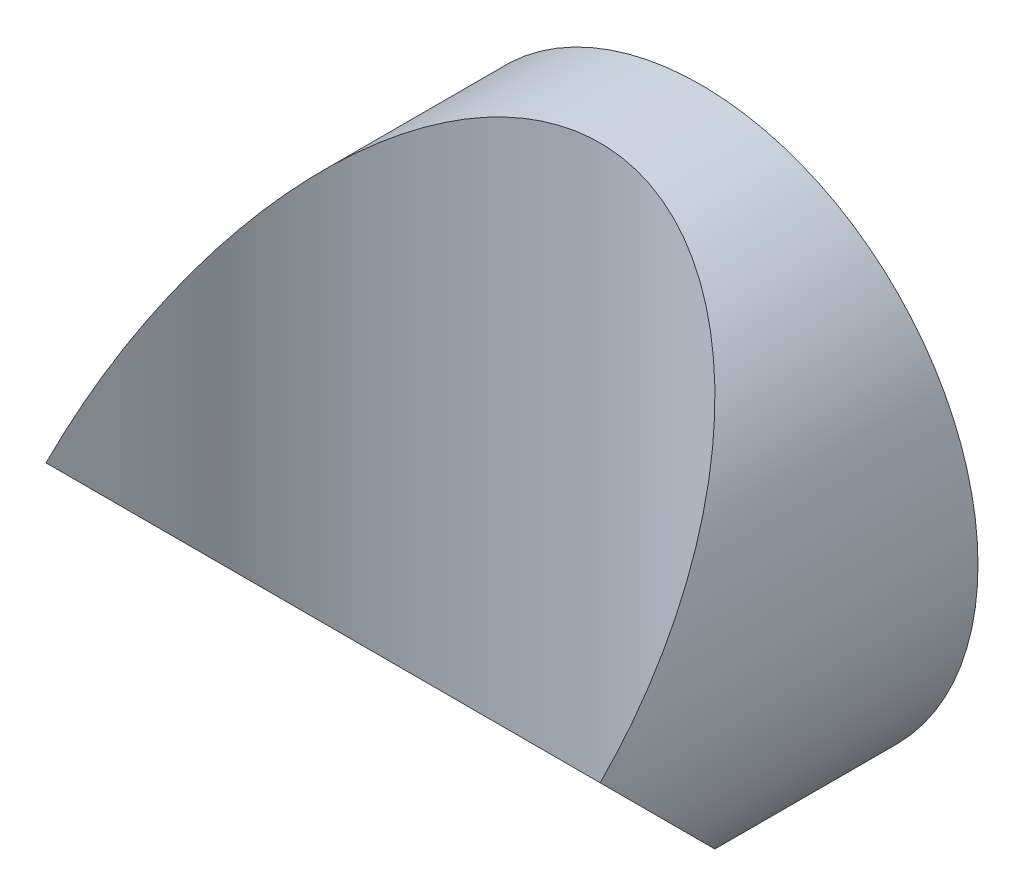
ISO-10303-21;
HEADER;
FILE_DESCRIPTION(('STEP AP214'),'2;1');
FILE_NAME('part.step','',(''),(''),'','','');
FILE_SCHEMA(('AUTOMOTIVE_DESIGN { 1 0 10303 214 1 1 1 1 }'));
ENDSEC;
DATA;
#1=APPLICATION_CONTEXT('core data for automotive mechanical design processes');
#2=APPLICATION_PROTOCOL_DEFINITION('international standard','automotive_design',2000,#1);
#3=PRODUCT_CONTEXT('',#1,'mechanical');
#4=PRODUCT('Part','Part','',(#3));
#5=PRODUCT_RELATED_PRODUCT_CATEGORY('part','',(#4));
#6=PRODUCT_DEFINITION_FORMATION('','',#4);
#7=PRODUCT_DEFINITION_CONTEXT('part definition',#1,'design');
#8=PRODUCT_DEFINITION('design','',#6,#7);
#9=PRODUCT_DEFINITION_SHAPE('','',#8);
#10=(LENGTH_UNIT() NAMED_UNIT(*) SI_UNIT(.MILLI.,.METRE.));
#11=(NAMED_UNIT(*) PLANE_ANGLE_UNIT() SI_UNIT($,.RADIAN.));
#12=(NAMED_UNIT(*) SI_UNIT($,.STERADIAN.) SOLID_ANGLE_UNIT());
#13=UNCERTAINTY_MEASURE_WITH_UNIT(LENGTH_MEASURE(1.E-05),#10,'distance_accuracy_value','');
#14=(GEOMETRIC_REPRESENTATION_CONTEXT(3) GLOBAL_UNCERTAINTY_ASSIGNED_CONTEXT((#13)) GLOBAL_UNIT_ASSIGNED_CONTEXT((#10,
#11,#12)) REPRESENTATION_CONTEXT('',''));
#15=CARTESIAN_POINT('',(0.,0.,0.));
#16=DIRECTION('',(0.,0.,1.));
#17=DIRECTION('',(1.,0.,0.));
#18=AXIS2_PLACEMENT_3D('',#15,#16,#17);
#19=CARTESIAN_POINT('',(0.,0.,27.27));
#20=DIRECTION('',(0.,0.,-1.));
#21=DIRECTION('',(-1.,0.,0.));
#22=AXIS2_PLACEMENT_3D('',#19,#20,#21);
#23=CYLINDRICAL_SURFACE('',#22,20.);
#24=CARTESIAN_POINT('',(0.,0.,0.));
#25=DIRECTION('',(0.,0.,1.));
#26=DIRECTION('',(1.,0.,0.));
#27=AXIS2_PLACEMENT_3D('',#24,#25,#26);
#28=CIRCLE('',#27,20.);
#29=CARTESIAN_POINT('',(20.,0.,0.));
#30=VERTEX_POINT('',#29);
#31=EDGE_CURVE('E11',#30,#30,#28,.T.);
#32=ORIENTED_EDGE('',*,*,#31,.T.);
#33=EDGE_LOOP('',(#32));
#34=FACE_BOUND('',#33,.T.);
#35=CARTESIAN_POINT('',(0.,0.,27.27));
#36=DIRECTION('',(0.,0.707106781186547,-0.707106781186547));
#37=DIRECTION('',(0.,-0.707106781186547,-0.707106781186547));
#38=AXIS2_PLACEMENT_3D('',#35,#36,#37);
#39=ELLIPSE('',#38,28.2842712474619,20.);
#40=CARTESIAN_POINT('',(-20.,0.,27.27));
#41=VERTEX_POINT('',#40);
#42=CARTESIAN_POINT('',(20.,0.,27.27));
#43=VERTEX_POINT('',#42);
#44=EDGE_CURVE('E54',#41,#43,#39,.F.);
#45=ORIENTED_EDGE('',*,*,#44,.F.);
#46=CARTESIAN_POINT('',(0.,0.,27.27));
#47=DIRECTION('',(0.,-0.707106781186547,-0.707106781186547));
#48=DIRECTION('',(0.,0.707106781186547,-0.707106781186547));
#49=AXIS2_PLACEMENT_3D('',#46,#47,#48);
#50=ELLIPSE('',#49,28.2842712474619,20.);
#51=EDGE_CURVE('E47',#43,#41,#50,.F.);
#52=ORIENTED_EDGE('',*,*,#51,.F.);
#53=EDGE_LOOP('',(#45,#52));
#54=FACE_BOUND('',#53,.T.);
#55=ADVANCED_FACE('F40',(#34,#54),#23,.T.);
#56=CARTESIAN_POINT('',(0.,0.,0.));
#57=DIRECTION('',(0.,0.,1.));
#58=DIRECTION('',(1.,0.,0.));
#59=AXIS2_PLACEMENT_3D('',#56,#57,#58);
#60=PLANE('',#59);
#61=ORIENTED_EDGE('',*,*,#31,.F.);
#62=EDGE_LOOP('',(#61));
#63=FACE_BOUND('',#62,.T.);
#64=ADVANCED_FACE('F59',(#63),#60,.F.);
#65=CARTESIAN_POINT('',(0.,20.,27.27));
#66=DIRECTION('',(0.,-1.,0.));
#67=DIRECTION('',(0.,0.,-1.));
#68=AXIS2_PLACEMENT_3D('',#65,#66,#67);
#69=CYLINDRICAL_SURFACE('',#68,20.);
#70=ORIENTED_EDGE('',*,*,#51,.T.);
#71=ORIENTED_EDGE('',*,*,#44,.T.);
#72=EDGE_LOOP('',(#70,#71));
#73=FACE_BOUND('',#72,.T.);
#74=ADVANCED_FACE('F55',(#73),#69,.F.);
#75=CLOSED_SHELL('',(#55,#64,#74));
#76=MANIFOLD_SOLID_BREP('B2',#75);
#77=ADVANCED_BREP_SHAPE_REPRESENTATION('',(#18,#76),#14);
#78=SHAPE_DEFINITION_REPRESENTATION(#9,#77);
ENDSEC;
END-ISO-10303-21;
